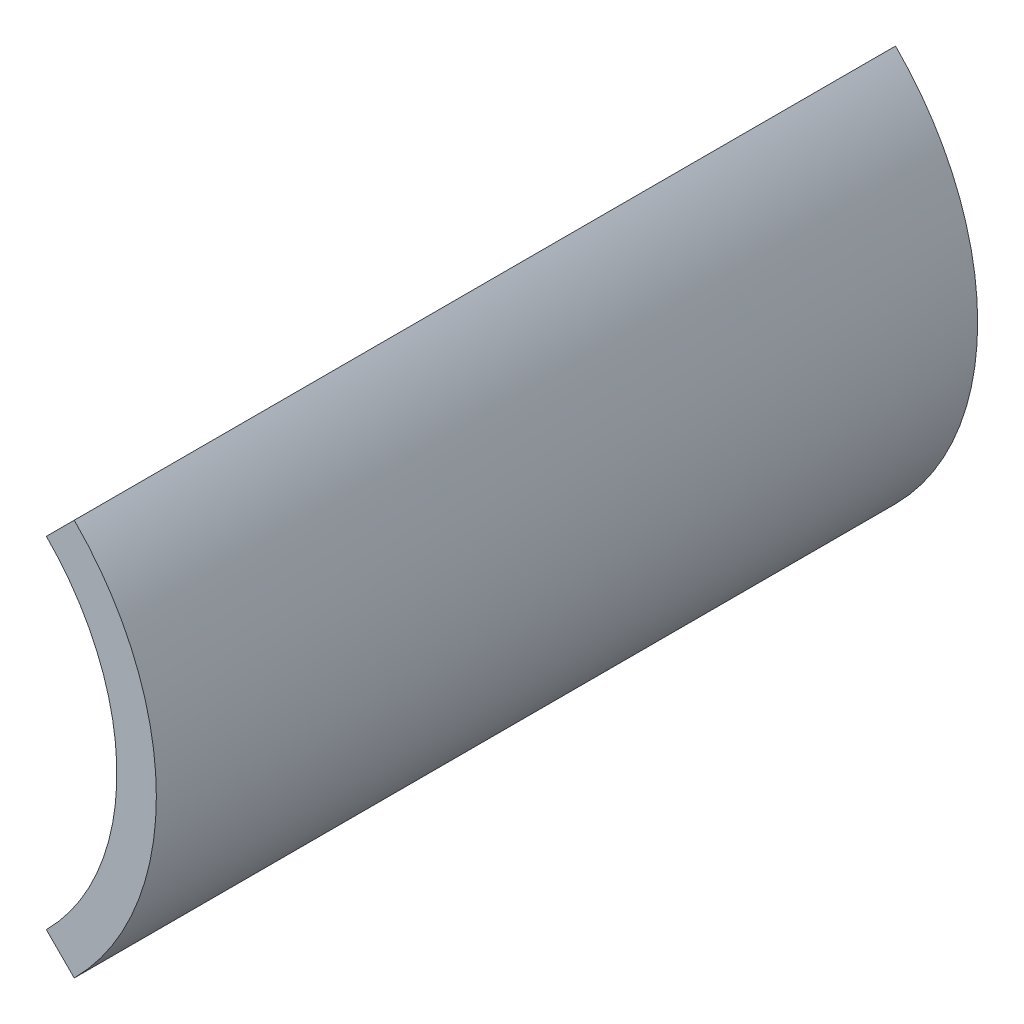
ISO-10303-21;
HEADER;
FILE_DESCRIPTION(('STEP AP214'),'2;1');
FILE_NAME('part.step','',(''),(''),'','','');
FILE_SCHEMA(('AUTOMOTIVE_DESIGN { 1 0 10303 214 1 1 1 1 }'));
ENDSEC;
DATA;
#1=APPLICATION_CONTEXT('core data for automotive mechanical design processes');
#2=APPLICATION_PROTOCOL_DEFINITION('international standard','automotive_design',2000,#1);
#3=PRODUCT_CONTEXT('',#1,'mechanical');
#4=PRODUCT('Part','Part','',(#3));
#5=PRODUCT_RELATED_PRODUCT_CATEGORY('part','',(#4));
#6=PRODUCT_DEFINITION_FORMATION('','',#4);
#7=PRODUCT_DEFINITION_CONTEXT('part definition',#1,'design');
#8=PRODUCT_DEFINITION('design','',#6,#7);
#9=PRODUCT_DEFINITION_SHAPE('','',#8);
#10=(LENGTH_UNIT() NAMED_UNIT(*) SI_UNIT(.MILLI.,.METRE.));
#11=(NAMED_UNIT(*) PLANE_ANGLE_UNIT() SI_UNIT($,.RADIAN.));
#12=(NAMED_UNIT(*) SI_UNIT($,.STERADIAN.) SOLID_ANGLE_UNIT());
#13=UNCERTAINTY_MEASURE_WITH_UNIT(LENGTH_MEASURE(1.E-05),#10,'distance_accuracy_value','');
#14=(GEOMETRIC_REPRESENTATION_CONTEXT(3) GLOBAL_UNCERTAINTY_ASSIGNED_CONTEXT((#13)) GLOBAL_UNIT_ASSIGNED_CONTEXT((#10,
#11,#12)) REPRESENTATION_CONTEXT('',''));
#15=CARTESIAN_POINT('',(0.,0.,0.));
#16=DIRECTION('',(0.,0.,1.));
#17=DIRECTION('',(1.,0.,0.));
#18=AXIS2_PLACEMENT_3D('',#15,#16,#17);
#19=CARTESIAN_POINT('',(0.,0.,26.));
#20=DIRECTION('',(0.,0.,-1.));
#21=DIRECTION('',(-1.,0.,0.));
#22=AXIS2_PLACEMENT_3D('',#19,#20,#21);
#23=CYLINDRICAL_SURFACE('',#22,15.25);
#24=CARTESIAN_POINT('',(0.,0.,-26.));
#25=DIRECTION('',(0.,0.,-1.));
#26=DIRECTION('',(1.,0.,0.));
#27=AXIS2_PLACEMENT_3D('',#24,#25,#26);
#28=CIRCLE('',#27,15.25);
#29=CARTESIAN_POINT('',(10.7833784130948,10.7833784130949,-26.));
#30=VERTEX_POINT('',#29);
#31=CARTESIAN_POINT('',(10.7833784130948,-10.7833784130949,-26.));
#32=VERTEX_POINT('',#31);
#33=EDGE_CURVE('E109',#30,#32,#28,.T.);
#34=ORIENTED_EDGE('',*,*,#33,.T.);
#35=DIRECTION('',(0.,0.,-1.));
#36=VECTOR('',#35,1.);
#37=CARTESIAN_POINT('',(10.7833784130948,-10.7833784130949,26.));
#38=LINE('',#37,#36);
#39=CARTESIAN_POINT('',(10.7833784130948,-10.7833784130949,26.));
#40=VERTEX_POINT('',#39);
#41=EDGE_CURVE('E11',#40,#32,#38,.T.);
#42=ORIENTED_EDGE('',*,*,#41,.F.);
#43=CARTESIAN_POINT('',(0.,0.,26.));
#44=DIRECTION('',(0.,0.,-1.));
#45=DIRECTION('',(1.,0.,0.));
#46=AXIS2_PLACEMENT_3D('',#43,#44,#45);
#47=CIRCLE('',#46,15.25);
#48=CARTESIAN_POINT('',(10.7833784130948,10.7833784130949,26.));
#49=VERTEX_POINT('',#48);
#50=EDGE_CURVE('E93',#49,#40,#47,.T.);
#51=ORIENTED_EDGE('',*,*,#50,.F.);
#52=DIRECTION('',(0.,0.,-1.));
#53=VECTOR('',#52,1.);
#54=CARTESIAN_POINT('',(10.7833784130948,10.7833784130949,26.));
#55=LINE('',#54,#53);
#56=EDGE_CURVE('E105',#49,#30,#55,.T.);
#57=ORIENTED_EDGE('',*,*,#56,.T.);
#58=EDGE_LOOP('',(#34,#42,#51,#57));
#59=FACE_BOUND('',#58,.T.);
#60=ADVANCED_FACE('F41',(#59),#23,.F.);
#61=CARTESIAN_POINT('',(10.7833784130948,-10.7833784130949,26.));
#62=DIRECTION('',(0.707106781186546,0.707106781186548,0.));
#63=DIRECTION('',(-0.707106781186549,0.707106781186547,0.));
#64=AXIS2_PLACEMENT_3D('',#61,#62,#63);
#65=PLANE('',#64);
#66=DIRECTION('',(0.707106781186549,-0.707106781186547,0.));
#67=VECTOR('',#66,1.);
#68=CARTESIAN_POINT('',(10.7833784130948,-10.7833784130949,-26.));
#69=LINE('',#68,#67);
#70=CARTESIAN_POINT('',(12.5511453660612,-12.5511453660612,-26.));
#71=VERTEX_POINT('',#70);
#72=EDGE_CURVE('E98',#32,#71,#69,.T.);
#73=ORIENTED_EDGE('',*,*,#72,.T.);
#74=DIRECTION('',(0.,0.,-1.));
#75=VECTOR('',#74,1.);
#76=CARTESIAN_POINT('',(12.5511453660612,-12.5511453660612,26.));
#77=LINE('',#76,#75);
#78=CARTESIAN_POINT('',(12.5511453660612,-12.5511453660612,26.));
#79=VERTEX_POINT('',#78);
#80=EDGE_CURVE('E50',#79,#71,#77,.T.);
#81=ORIENTED_EDGE('',*,*,#80,.F.);
#82=DIRECTION('',(0.707106781186549,-0.707106781186547,0.));
#83=VECTOR('',#82,1.);
#84=CARTESIAN_POINT('',(10.7833784130948,-10.7833784130949,26.));
#85=LINE('',#84,#83);
#86=EDGE_CURVE('E88',#40,#79,#85,.T.);
#87=ORIENTED_EDGE('',*,*,#86,.F.);
#88=ORIENTED_EDGE('',*,*,#41,.T.);
#89=EDGE_LOOP('',(#73,#81,#87,#88));
#90=FACE_BOUND('',#89,.T.);
#91=ADVANCED_FACE('F97',(#90),#65,.F.);
#92=CARTESIAN_POINT('',(0.,0.,26.));
#93=DIRECTION('',(0.,0.,-1.));
#94=DIRECTION('',(-1.,0.,0.));
#95=AXIS2_PLACEMENT_3D('',#92,#93,#94);
#96=CYLINDRICAL_SURFACE('',#95,17.75);
#97=CARTESIAN_POINT('',(0.,0.,-26.));
#98=DIRECTION('',(0.,0.,1.));
#99=DIRECTION('',(1.,0.,0.));
#100=AXIS2_PLACEMENT_3D('',#97,#98,#99);
#101=CIRCLE('',#100,17.75);
#102=CARTESIAN_POINT('',(12.5511453660612,12.5511453660613,-26.));
#103=VERTEX_POINT('',#102);
#104=EDGE_CURVE('E75',#71,#103,#101,.T.);
#105=ORIENTED_EDGE('',*,*,#104,.T.);
#106=DIRECTION('',(0.,0.,-1.));
#107=VECTOR('',#106,1.);
#108=CARTESIAN_POINT('',(12.5511453660612,12.5511453660613,26.));
#109=LINE('',#108,#107);
#110=CARTESIAN_POINT('',(12.5511453660612,12.5511453660613,26.));
#111=VERTEX_POINT('',#110);
#112=EDGE_CURVE('E100',#111,#103,#109,.T.);
#113=ORIENTED_EDGE('',*,*,#112,.F.);
#114=CARTESIAN_POINT('',(0.,0.,26.));
#115=DIRECTION('',(0.,0.,1.));
#116=DIRECTION('',(1.,0.,0.));
#117=AXIS2_PLACEMENT_3D('',#114,#115,#116);
#118=CIRCLE('',#117,17.75);
#119=EDGE_CURVE('E91',#79,#111,#118,.T.);
#120=ORIENTED_EDGE('',*,*,#119,.F.);
#121=ORIENTED_EDGE('',*,*,#80,.T.);
#122=EDGE_LOOP('',(#105,#113,#120,#121));
#123=FACE_BOUND('',#122,.T.);
#124=ADVANCED_FACE('F101',(#123),#96,.T.);
#125=CARTESIAN_POINT('',(10.7833784130948,10.7833784130949,26.));
#126=DIRECTION('',(0.70710678118655,-0.707106781186545,0.));
#127=DIRECTION('',(0.707106781186545,0.70710678118655,0.));
#128=AXIS2_PLACEMENT_3D('',#125,#126,#127);
#129=PLANE('',#128);
#130=DIRECTION('',(-0.707106781186545,-0.70710678118655,0.));
#131=VECTOR('',#130,1.);
#132=CARTESIAN_POINT('',(10.7833784130948,10.7833784130949,-26.));
#133=LINE('',#132,#131);
#134=EDGE_CURVE('E81',#103,#30,#133,.T.);
#135=ORIENTED_EDGE('',*,*,#134,.T.);
#136=ORIENTED_EDGE('',*,*,#56,.F.);
#137=DIRECTION('',(-0.707106781186545,-0.70710678118655,0.));
#138=VECTOR('',#137,1.);
#139=CARTESIAN_POINT('',(10.7833784130948,10.7833784130949,26.));
#140=LINE('',#139,#138);
#141=EDGE_CURVE('E58',#111,#49,#140,.T.);
#142=ORIENTED_EDGE('',*,*,#141,.F.);
#143=ORIENTED_EDGE('',*,*,#112,.T.);
#144=EDGE_LOOP('',(#135,#136,#142,#143));
#145=FACE_BOUND('',#144,.T.);
#146=ADVANCED_FACE('F122',(#145),#129,.F.);
#147=CARTESIAN_POINT('',(0.,0.,26.));
#148=DIRECTION('',(0.,0.,1.));
#149=DIRECTION('',(1.,0.,0.));
#150=AXIS2_PLACEMENT_3D('',#147,#148,#149);
#151=PLANE('',#150);
#152=ORIENTED_EDGE('',*,*,#50,.T.);
#153=ORIENTED_EDGE('',*,*,#86,.T.);
#154=ORIENTED_EDGE('',*,*,#119,.T.);
#155=ORIENTED_EDGE('',*,*,#141,.T.);
#156=EDGE_LOOP('',(#152,#153,#154,#155));
#157=FACE_BOUND('',#156,.T.);
#158=ADVANCED_FACE('F89',(#157),#151,.T.);
#159=CARTESIAN_POINT('',(0.,0.,-26.));
#160=DIRECTION('',(0.,0.,1.));
#161=DIRECTION('',(1.,0.,0.));
#162=AXIS2_PLACEMENT_3D('',#159,#160,#161);
#163=PLANE('',#162);
#164=ORIENTED_EDGE('',*,*,#33,.F.);
#165=ORIENTED_EDGE('',*,*,#134,.F.);
#166=ORIENTED_EDGE('',*,*,#104,.F.);
#167=ORIENTED_EDGE('',*,*,#72,.F.);
#168=EDGE_LOOP('',(#164,#165,#166,#167));
#169=FACE_BOUND('',#168,.T.);
#170=ADVANCED_FACE('F125',(#169),#163,.F.);
#171=CLOSED_SHELL('',(#60,#91,#124,#146,#158,#170));
#172=MANIFOLD_SOLID_BREP('B2',#171);
#173=ADVANCED_BREP_SHAPE_REPRESENTATION('',(#18,#172),#14);
#174=SHAPE_DEFINITION_REPRESENTATION(#9,#173);
ENDSEC;
END-ISO-10303-21;
